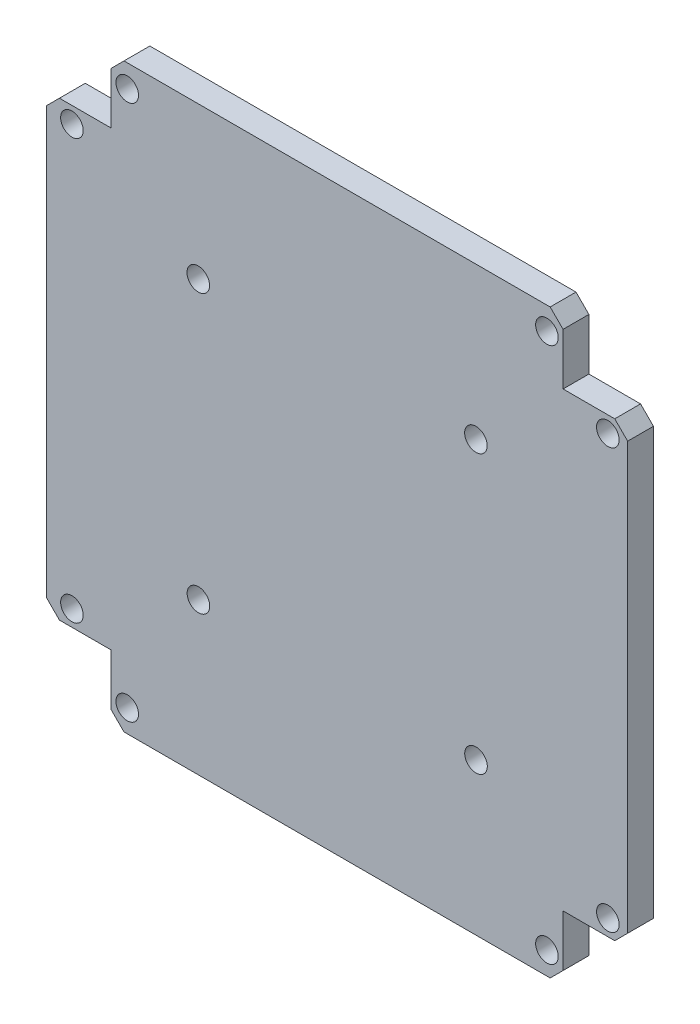
ISO-10303-21;
HEADER;
FILE_DESCRIPTION(('STEP AP214'),'2;1');
FILE_NAME('part.step','',(''),(''),'','','');
FILE_SCHEMA(('AUTOMOTIVE_DESIGN { 1 0 10303 214 1 1 1 1 }'));
ENDSEC;
DATA;
#1=APPLICATION_CONTEXT('core data for automotive mechanical design processes');
#2=APPLICATION_PROTOCOL_DEFINITION('international standard','automotive_design',2000,#1);
#3=PRODUCT_CONTEXT('',#1,'mechanical');
#4=PRODUCT('Part','Part','',(#3));
#5=PRODUCT_RELATED_PRODUCT_CATEGORY('part','',(#4));
#6=PRODUCT_DEFINITION_FORMATION('','',#4);
#7=PRODUCT_DEFINITION_CONTEXT('part definition',#1,'design');
#8=PRODUCT_DEFINITION('design','',#6,#7);
#9=PRODUCT_DEFINITION_SHAPE('','',#8);
#10=(LENGTH_UNIT() NAMED_UNIT(*) SI_UNIT(.MILLI.,.METRE.));
#11=(NAMED_UNIT(*) PLANE_ANGLE_UNIT() SI_UNIT($,.RADIAN.));
#12=(NAMED_UNIT(*) SI_UNIT($,.STERADIAN.) SOLID_ANGLE_UNIT());
#13=UNCERTAINTY_MEASURE_WITH_UNIT(LENGTH_MEASURE(1.E-05),#10,'distance_accuracy_value','');
#14=(GEOMETRIC_REPRESENTATION_CONTEXT(3) GLOBAL_UNCERTAINTY_ASSIGNED_CONTEXT((#13)) GLOBAL_UNIT_ASSIGNED_CONTEXT((#10,
#11,#12)) REPRESENTATION_CONTEXT('',''));
#15=CARTESIAN_POINT('',(0.,0.,0.));
#16=DIRECTION('',(0.,0.,1.));
#17=DIRECTION('',(1.,0.,0.));
#18=AXIS2_PLACEMENT_3D('',#15,#16,#17);
#19=CARTESIAN_POINT('',(-0.231726764970422,0.19337016574586,4.));
#20=DIRECTION('',(0.,1.,0.));
#21=DIRECTION('',(0.,0.,1.));
#22=AXIS2_PLACEMENT_3D('',#19,#20,#21);
#23=PLANE('',#22);
#24=DIRECTION('',(0.,0.,-1.));
#25=VECTOR('',#24,1.);
#26=CARTESIAN_POINT('',(9.76827323502952,0.19337016574586,3.99999999999999));
#27=LINE('',#26,#25);
#28=CARTESIAN_POINT('',(9.76827323502951,0.19337016574586,4.));
#29=VERTEX_POINT('',#28);
#30=CARTESIAN_POINT('',(9.76827323502951,0.19337016574586,0.));
#31=VERTEX_POINT('',#30);
#32=EDGE_CURVE('E191',#29,#31,#27,.T.);
#33=ORIENTED_EDGE('',*,*,#32,.F.);
#34=DIRECTION('',(1.,0.,0.));
#35=VECTOR('',#34,1.);
#36=CARTESIAN_POINT('',(-0.231726764970422,0.19337016574586,4.));
#37=LINE('',#36,#35);
#38=CARTESIAN_POINT('',(1.76827323502958,0.19337016574586,4.));
#39=VERTEX_POINT('',#38);
#40=EDGE_CURVE('E185',#39,#29,#37,.T.);
#41=ORIENTED_EDGE('',*,*,#40,.F.);
#42=DIRECTION('',(0.,0.,-1.));
#43=VECTOR('',#42,1.);
#44=CARTESIAN_POINT('',(1.76827323502958,0.19337016574586,4.));
#45=LINE('',#44,#43);
#46=CARTESIAN_POINT('',(1.76827323502958,0.19337016574586,0.));
#47=VERTEX_POINT('',#46);
#48=EDGE_CURVE('E304',#39,#47,#45,.T.);
#49=ORIENTED_EDGE('',*,*,#48,.T.);
#50=DIRECTION('',(1.,0.,0.));
#51=VECTOR('',#50,1.);
#52=CARTESIAN_POINT('',(-0.231726764970422,0.19337016574586,0.));
#53=LINE('',#52,#51);
#54=EDGE_CURVE('E265',#47,#31,#53,.T.);
#55=ORIENTED_EDGE('',*,*,#54,.T.);
#56=EDGE_LOOP('',(#33,#41,#49,#55));
#57=FACE_BOUND('',#56,.T.);
#58=ADVANCED_FACE('F33',(#57),#23,.F.);
#59=DIRECTION('',(0.,0.,1.));
#60=VECTOR('',#59,1.);
#61=CARTESIAN_POINT('',(79.7682732350295,0.19337016574586,4.));
#62=LINE('',#61,#60);
#63=CARTESIAN_POINT('',(79.7682732350295,0.19337016574586,0.));
#64=VERTEX_POINT('',#63);
#65=CARTESIAN_POINT('',(79.7682732350295,0.19337016574586,4.));
#66=VERTEX_POINT('',#65);
#67=EDGE_CURVE('E180',#64,#66,#62,.T.);
#68=ORIENTED_EDGE('',*,*,#67,.F.);
#69=CARTESIAN_POINT('',(87.7682732350295,0.19337016574586,0.));
#70=VERTEX_POINT('',#69);
#71=EDGE_CURVE('E263',#64,#70,#53,.T.);
#72=ORIENTED_EDGE('',*,*,#71,.T.);
#73=DIRECTION('',(0.,0.,1.));
#74=VECTOR('',#73,1.);
#75=CARTESIAN_POINT('',(87.7682732350295,0.19337016574586,4.));
#76=LINE('',#75,#74);
#77=CARTESIAN_POINT('',(87.7682732350295,0.19337016574586,4.));
#78=VERTEX_POINT('',#77);
#79=EDGE_CURVE('E183',#70,#78,#76,.T.);
#80=ORIENTED_EDGE('',*,*,#79,.T.);
#81=EDGE_CURVE('E169',#66,#78,#37,.T.);
#82=ORIENTED_EDGE('',*,*,#81,.F.);
#83=EDGE_LOOP('',(#68,#72,#80,#82));
#84=FACE_BOUND('',#83,.T.);
#85=ADVANCED_FACE('F179',(#84),#23,.F.);
#86=CARTESIAN_POINT('',(-0.231726764970422,70.1933701657459,4.));
#87=DIRECTION('',(0.,-1.,0.));
#88=DIRECTION('',(0.,0.,-1.));
#89=AXIS2_PLACEMENT_3D('',#86,#87,#88);
#90=PLANE('',#89);
#91=DIRECTION('',(0.,0.,1.));
#92=VECTOR('',#91,1.);
#93=CARTESIAN_POINT('',(9.76827323502961,70.1933701657459,4.));
#94=LINE('',#93,#92);
#95=CARTESIAN_POINT('',(9.7682732350296,70.1933701657459,0.));
#96=VERTEX_POINT('',#95);
#97=CARTESIAN_POINT('',(9.7682732350296,70.1933701657459,4.));
#98=VERTEX_POINT('',#97);
#99=EDGE_CURVE('E205',#96,#98,#94,.T.);
#100=ORIENTED_EDGE('',*,*,#99,.F.);
#101=DIRECTION('',(-1.,0.,0.));
#102=VECTOR('',#101,1.);
#103=CARTESIAN_POINT('',(-0.231726764970422,70.1933701657459,0.));
#104=LINE('',#103,#102);
#105=CARTESIAN_POINT('',(1.76827323502961,70.1933701657459,0.));
#106=VERTEX_POINT('',#105);
#107=EDGE_CURVE('E271',#96,#106,#104,.T.);
#108=ORIENTED_EDGE('',*,*,#107,.T.);
#109=DIRECTION('',(0.,0.,1.));
#110=VECTOR('',#109,1.);
#111=CARTESIAN_POINT('',(1.76827323502961,70.1933701657459,4.));
#112=LINE('',#111,#110);
#113=CARTESIAN_POINT('',(1.76827323502961,70.1933701657459,4.));
#114=VERTEX_POINT('',#113);
#115=EDGE_CURVE('E321',#106,#114,#112,.T.);
#116=ORIENTED_EDGE('',*,*,#115,.T.);
#117=DIRECTION('',(-1.,0.,0.));
#118=VECTOR('',#117,1.);
#119=CARTESIAN_POINT('',(-0.231726764970422,70.1933701657459,4.));
#120=LINE('',#119,#118);
#121=EDGE_CURVE('E256',#98,#114,#120,.T.);
#122=ORIENTED_EDGE('',*,*,#121,.F.);
#123=EDGE_LOOP('',(#100,#108,#116,#122));
#124=FACE_BOUND('',#123,.T.);
#125=ADVANCED_FACE('F486',(#124),#90,.F.);
#126=DIRECTION('',(0.,0.,-1.));
#127=VECTOR('',#126,1.);
#128=CARTESIAN_POINT('',(79.7682732350296,70.1933701657459,4.));
#129=LINE('',#128,#127);
#130=CARTESIAN_POINT('',(79.7682732350296,70.1933701657459,4.));
#131=VERTEX_POINT('',#130);
#132=CARTESIAN_POINT('',(79.7682732350296,70.1933701657459,0.));
#133=VERTEX_POINT('',#132);
#134=EDGE_CURVE('E210',#131,#133,#129,.T.);
#135=ORIENTED_EDGE('',*,*,#134,.F.);
#136=CARTESIAN_POINT('',(87.7682732350295,70.1933701657459,4.));
#137=VERTEX_POINT('',#136);
#138=EDGE_CURVE('E257',#137,#131,#120,.T.);
#139=ORIENTED_EDGE('',*,*,#138,.F.);
#140=DIRECTION('',(0.,0.,-1.));
#141=VECTOR('',#140,1.);
#142=CARTESIAN_POINT('',(87.7682732350296,70.1933701657459,4.));
#143=LINE('',#142,#141);
#144=CARTESIAN_POINT('',(87.7682732350295,70.1933701657459,0.));
#145=VERTEX_POINT('',#144);
#146=EDGE_CURVE('E326',#137,#145,#143,.T.);
#147=ORIENTED_EDGE('',*,*,#146,.T.);
#148=EDGE_CURVE('E250',#145,#133,#104,.T.);
#149=ORIENTED_EDGE('',*,*,#148,.T.);
#150=EDGE_LOOP('',(#135,#139,#147,#149));
#151=FACE_BOUND('',#150,.T.);
#152=ADVANCED_FACE('F392',(#151),#90,.F.);
#153=CARTESIAN_POINT('',(-0.231726764970422,0.19337016574586,4.));
#154=DIRECTION('',(1.,0.,0.));
#155=DIRECTION('',(0.,0.,-1.));
#156=AXIS2_PLACEMENT_3D('',#153,#154,#155);
#157=PLANE('',#156);
#158=DIRECTION('',(0.,-1.,0.));
#159=VECTOR('',#158,1.);
#160=CARTESIAN_POINT('',(-0.231726764970422,0.19337016574586,4.));
#161=LINE('',#160,#159);
#162=CARTESIAN_POINT('',(-0.231726764970422,68.1933701657458,4.));
#163=VERTEX_POINT('',#162);
#164=CARTESIAN_POINT('',(-0.231726764970422,2.19337016574588,4.));
#165=VERTEX_POINT('',#164);
#166=EDGE_CURVE('E186',#163,#165,#161,.T.);
#167=ORIENTED_EDGE('',*,*,#166,.F.);
#168=DIRECTION('',(0.,0.,-1.));
#169=VECTOR('',#168,1.);
#170=CARTESIAN_POINT('',(-0.231726764970422,68.1933701657458,4.));
#171=LINE('',#170,#169);
#172=CARTESIAN_POINT('',(-0.231726764970422,68.1933701657458,0.));
#173=VERTEX_POINT('',#172);
#174=EDGE_CURVE('E315',#163,#173,#171,.T.);
#175=ORIENTED_EDGE('',*,*,#174,.T.);
#176=DIRECTION('',(0.,-1.,0.));
#177=VECTOR('',#176,1.);
#178=CARTESIAN_POINT('',(-0.231726764970422,0.19337016574586,0.));
#179=LINE('',#178,#177);
#180=CARTESIAN_POINT('',(-0.231726764970422,2.19337016574588,0.));
#181=VERTEX_POINT('',#180);
#182=EDGE_CURVE('E261',#173,#181,#179,.T.);
#183=ORIENTED_EDGE('',*,*,#182,.T.);
#184=DIRECTION('',(0.,0.,1.));
#185=VECTOR('',#184,1.);
#186=CARTESIAN_POINT('',(-0.231726764970422,2.19337016574588,4.));
#187=LINE('',#186,#185);
#188=EDGE_CURVE('E310',#181,#165,#187,.T.);
#189=ORIENTED_EDGE('',*,*,#188,.T.);
#190=EDGE_LOOP('',(#167,#175,#183,#189));
#191=FACE_BOUND('',#190,.T.);
#192=ADVANCED_FACE('F477',(#191),#157,.F.);
#193=CARTESIAN_POINT('',(89.7682732350296,0.19337016574586,4.));
#194=DIRECTION('',(-1.,0.,0.));
#195=DIRECTION('',(0.,0.,1.));
#196=AXIS2_PLACEMENT_3D('',#193,#194,#195);
#197=PLANE('',#196);
#198=DIRECTION('',(0.,1.,0.));
#199=VECTOR('',#198,1.);
#200=CARTESIAN_POINT('',(89.7682732350296,0.19337016574586,0.));
#201=LINE('',#200,#199);
#202=CARTESIAN_POINT('',(89.7682732350296,2.19337016574588,0.));
#203=VERTEX_POINT('',#202);
#204=CARTESIAN_POINT('',(89.7682732350296,68.1933701657458,0.));
#205=VERTEX_POINT('',#204);
#206=EDGE_CURVE('E268',#203,#205,#201,.T.);
#207=ORIENTED_EDGE('',*,*,#206,.T.);
#208=DIRECTION('',(0.,0.,1.));
#209=VECTOR('',#208,1.);
#210=CARTESIAN_POINT('',(89.7682732350296,68.1933701657458,4.));
#211=LINE('',#210,#209);
#212=CARTESIAN_POINT('',(89.7682732350296,68.1933701657458,4.));
#213=VERTEX_POINT('',#212);
#214=EDGE_CURVE('E331',#205,#213,#211,.T.);
#215=ORIENTED_EDGE('',*,*,#214,.T.);
#216=DIRECTION('',(0.,1.,0.));
#217=VECTOR('',#216,1.);
#218=CARTESIAN_POINT('',(89.7682732350296,0.19337016574586,4.));
#219=LINE('',#218,#217);
#220=CARTESIAN_POINT('',(89.7682732350296,2.19337016574588,4.));
#221=VERTEX_POINT('',#220);
#222=EDGE_CURVE('E253',#221,#213,#219,.T.);
#223=ORIENTED_EDGE('',*,*,#222,.F.);
#224=DIRECTION('',(0.,0.,-1.));
#225=VECTOR('',#224,1.);
#226=CARTESIAN_POINT('',(89.7682732350296,2.19337016574588,4.));
#227=LINE('',#226,#225);
#228=EDGE_CURVE('E260',#221,#203,#227,.T.);
#229=ORIENTED_EDGE('',*,*,#228,.T.);
#230=EDGE_LOOP('',(#207,#215,#223,#229));
#231=FACE_BOUND('',#230,.T.);
#232=ADVANCED_FACE('F401',(#231),#197,.F.);
#233=CARTESIAN_POINT('',(0.,0.,4.));
#234=DIRECTION('',(0.,0.,-1.));
#235=DIRECTION('',(-1.,0.,0.));
#236=AXIS2_PLACEMENT_3D('',#233,#234,#235);
#237=PLANE('',#236);
#238=CARTESIAN_POINT('',(12.2682732350295,-6.30662983425415,4.));
#239=DIRECTION('',(0.,0.,-1.));
#240=DIRECTION('',(-1.,0.,0.));
#241=AXIS2_PLACEMENT_3D('',#238,#239,#240);
#242=CIRCLE('',#241,1.75);
#243=CARTESIAN_POINT('',(10.5182732350295,-6.30662983425415,4.));
#244=VERTEX_POINT('',#243);
#245=EDGE_CURVE('E197',#244,#244,#242,.T.);
#246=ORIENTED_EDGE('',*,*,#245,.T.);
#247=EDGE_LOOP('',(#246));
#248=FACE_BOUND('',#247,.T.);
#249=CARTESIAN_POINT('',(77.2682732350295,-6.30662983425415,4.));
#250=DIRECTION('',(0.,0.,-1.));
#251=DIRECTION('',(-1.,0.,0.));
#252=AXIS2_PLACEMENT_3D('',#249,#250,#251);
#253=CIRCLE('',#252,1.75);
#254=CARTESIAN_POINT('',(75.5182732350295,-6.30662983425415,4.));
#255=VERTEX_POINT('',#254);
#256=EDGE_CURVE('E417',#255,#255,#253,.T.);
#257=ORIENTED_EDGE('',*,*,#256,.T.);
#258=EDGE_LOOP('',(#257));
#259=FACE_BOUND('',#258,.T.);
#260=CARTESIAN_POINT('',(77.2682732350296,76.6933701657459,4.));
#261=DIRECTION('',(0.,0.,-1.));
#262=DIRECTION('',(-1.,0.,0.));
#263=AXIS2_PLACEMENT_3D('',#260,#261,#262);
#264=CIRCLE('',#263,1.75);
#265=CARTESIAN_POINT('',(75.5182732350296,76.6933701657459,4.));
#266=VERTEX_POINT('',#265);
#267=EDGE_CURVE('E420',#266,#266,#264,.T.);
#268=ORIENTED_EDGE('',*,*,#267,.T.);
#269=EDGE_LOOP('',(#268));
#270=FACE_BOUND('',#269,.T.);
#271=CARTESIAN_POINT('',(12.2682732350296,76.6933701657459,4.));
#272=DIRECTION('',(0.,0.,-1.));
#273=DIRECTION('',(-1.,0.,0.));
#274=AXIS2_PLACEMENT_3D('',#271,#272,#273);
#275=CIRCLE('',#274,1.75);
#276=CARTESIAN_POINT('',(10.5182732350296,76.6933701657459,4.));
#277=VERTEX_POINT('',#276);
#278=EDGE_CURVE('E423',#277,#277,#275,.T.);
#279=ORIENTED_EDGE('',*,*,#278,.T.);
#280=EDGE_LOOP('',(#279));
#281=FACE_BOUND('',#280,.T.);
#282=CARTESIAN_POINT('',(86.7035687828234,2.69443656663015,4.));
#283=DIRECTION('',(0.,0.,1.));
#284=DIRECTION('',(1.,0.,0.));
#285=AXIS2_PLACEMENT_3D('',#282,#283,#284);
#286=CIRCLE('',#285,1.75);
#287=CARTESIAN_POINT('',(88.4535687828234,2.69443656663015,4.));
#288=VERTEX_POINT('',#287);
#289=EDGE_CURVE('E235',#288,#288,#286,.T.);
#290=ORIENTED_EDGE('',*,*,#289,.F.);
#291=EDGE_LOOP('',(#290));
#292=FACE_BOUND('',#291,.T.);
#293=CARTESIAN_POINT('',(86.7032732350296,67.6933701657459,4.));
#294=DIRECTION('',(0.,0.,1.));
#295=DIRECTION('',(1.,0.,0.));
#296=AXIS2_PLACEMENT_3D('',#293,#294,#295);
#297=CIRCLE('',#296,1.75);
#298=CARTESIAN_POINT('',(88.4532732350296,67.6933701657459,4.));
#299=VERTEX_POINT('',#298);
#300=EDGE_CURVE('E239',#299,#299,#297,.T.);
#301=ORIENTED_EDGE('',*,*,#300,.F.);
#302=EDGE_LOOP('',(#301));
#303=FACE_BOUND('',#302,.T.);
#304=CARTESIAN_POINT('',(3.70327323502957,67.6933701657459,4.));
#305=DIRECTION('',(0.,0.,1.));
#306=DIRECTION('',(1.,0.,0.));
#307=AXIS2_PLACEMENT_3D('',#304,#305,#306);
#308=CIRCLE('',#307,1.75);
#309=CARTESIAN_POINT('',(5.45327323502957,67.6933701657459,4.));
#310=VERTEX_POINT('',#309);
#311=EDGE_CURVE('E242',#310,#310,#308,.T.);
#312=ORIENTED_EDGE('',*,*,#311,.F.);
#313=EDGE_LOOP('',(#312));
#314=FACE_BOUND('',#313,.T.);
#315=CARTESIAN_POINT('',(66.2840519009856,13.6933701657459,4.));
#316=DIRECTION('',(0.,0.,1.));
#317=DIRECTION('',(1.,0.,0.));
#318=AXIS2_PLACEMENT_3D('',#315,#316,#317);
#319=CIRCLE('',#318,1.75);
#320=CARTESIAN_POINT('',(68.0340519009856,13.6933701657459,4.));
#321=VERTEX_POINT('',#320);
#322=EDGE_CURVE('E232',#321,#321,#319,.T.);
#323=ORIENTED_EDGE('',*,*,#322,.F.);
#324=EDGE_LOOP('',(#323));
#325=FACE_BOUND('',#324,.T.);
#326=CARTESIAN_POINT('',(23.2682732350296,56.6933701657459,4.));
#327=DIRECTION('',(0.,0.,1.));
#328=DIRECTION('',(1.,0.,0.));
#329=AXIS2_PLACEMENT_3D('',#326,#327,#328);
#330=CIRCLE('',#329,1.75);
#331=CARTESIAN_POINT('',(25.0182732350296,56.6933701657459,4.));
#332=VERTEX_POINT('',#331);
#333=EDGE_CURVE('E225',#332,#332,#330,.T.);
#334=ORIENTED_EDGE('',*,*,#333,.F.);
#335=EDGE_LOOP('',(#334));
#336=FACE_BOUND('',#335,.T.);
#337=CARTESIAN_POINT('',(66.2682732350296,56.6933701657459,4.));
#338=DIRECTION('',(0.,0.,1.));
#339=DIRECTION('',(1.,0.,0.));
#340=AXIS2_PLACEMENT_3D('',#337,#338,#339);
#341=CIRCLE('',#340,1.75);
#342=CARTESIAN_POINT('',(68.0182732350296,56.6933701657459,4.));
#343=VERTEX_POINT('',#342);
#344=EDGE_CURVE('E228',#343,#343,#341,.T.);
#345=ORIENTED_EDGE('',*,*,#344,.F.);
#346=EDGE_LOOP('',(#345));
#347=FACE_BOUND('',#346,.T.);
#348=CARTESIAN_POINT('',(23.2977256719141,13.6933701657459,4.));
#349=DIRECTION('',(0.,0.,1.));
#350=DIRECTION('',(1.,0.,0.));
#351=AXIS2_PLACEMENT_3D('',#348,#349,#350);
#352=CIRCLE('',#351,1.75);
#353=CARTESIAN_POINT('',(25.0477256719141,13.6933701657459,4.));
#354=VERTEX_POINT('',#353);
#355=EDGE_CURVE('E229',#354,#354,#352,.T.);
#356=ORIENTED_EDGE('',*,*,#355,.F.);
#357=EDGE_LOOP('',(#356));
#358=FACE_BOUND('',#357,.T.);
#359=CARTESIAN_POINT('',(3.70356878282337,2.69337016574586,4.));
#360=DIRECTION('',(0.,0.,1.));
#361=DIRECTION('',(1.,0.,0.));
#362=AXIS2_PLACEMENT_3D('',#359,#360,#361);
#363=CIRCLE('',#362,1.75);
#364=CARTESIAN_POINT('',(5.45356878282337,2.69337016574586,4.));
#365=VERTEX_POINT('',#364);
#366=EDGE_CURVE('E238',#365,#365,#363,.T.);
#367=ORIENTED_EDGE('',*,*,#366,.F.);
#368=EDGE_LOOP('',(#367));
#369=FACE_BOUND('',#368,.T.);
#370=DIRECTION('',(0.,1.,0.));
#371=VECTOR('',#370,1.);
#372=CARTESIAN_POINT('',(9.76827323502952,-9.80662983425414,3.99999999999999));
#373=LINE('',#372,#371);
#374=CARTESIAN_POINT('',(9.76827323502952,-7.80662983425414,3.99999999999999));
#375=VERTEX_POINT('',#374);
#376=EDGE_CURVE('E175',#375,#29,#373,.T.);
#377=ORIENTED_EDGE('',*,*,#376,.F.);
#378=DIRECTION('',(0.707106781186545,-0.70710678118655,0.));
#379=VECTOR('',#378,1.);
#380=CARTESIAN_POINT('',(11.7682732350295,-9.80662983425414,4.));
#381=LINE('',#380,#379);
#382=CARTESIAN_POINT('',(11.7682732350295,-9.80662983425414,3.99999999999999));
#383=VERTEX_POINT('',#382);
#384=EDGE_CURVE('E355',#375,#383,#381,.T.);
#385=ORIENTED_EDGE('',*,*,#384,.T.);
#386=DIRECTION('',(-1.,0.,0.));
#387=VECTOR('',#386,1.);
#388=CARTESIAN_POINT('',(9.76827323502952,-9.80662983425414,3.99999999999999));
#389=LINE('',#388,#387);
#390=CARTESIAN_POINT('',(77.7682732350296,-9.80662983425414,4.));
#391=VERTEX_POINT('',#390);
#392=EDGE_CURVE('E194',#391,#383,#389,.T.);
#393=ORIENTED_EDGE('',*,*,#392,.F.);
#394=DIRECTION('',(0.707106781186543,0.707106781186552,0.));
#395=VECTOR('',#394,1.);
#396=CARTESIAN_POINT('',(77.7682732350296,-9.80662983425414,4.));
#397=LINE('',#396,#395);
#398=CARTESIAN_POINT('',(79.7682732350295,-7.80662983425414,4.));
#399=VERTEX_POINT('',#398);
#400=EDGE_CURVE('E48',#391,#399,#397,.T.);
#401=ORIENTED_EDGE('',*,*,#400,.T.);
#402=DIRECTION('',(0.,1.,0.));
#403=VECTOR('',#402,1.);
#404=CARTESIAN_POINT('',(79.7682732350295,-9.80662983425414,4.));
#405=LINE('',#404,#403);
#406=EDGE_CURVE('E165',#399,#66,#405,.T.);
#407=ORIENTED_EDGE('',*,*,#406,.T.);
#408=ORIENTED_EDGE('',*,*,#81,.T.);
#409=DIRECTION('',(-0.70710678118655,-0.707106781186545,0.));
#410=VECTOR('',#409,1.);
#411=CARTESIAN_POINT('',(89.7682732350296,2.19337016574588,4.));
#412=LINE('',#411,#410);
#413=EDGE_CURVE('E302',#78,#221,#412,.F.);
#414=ORIENTED_EDGE('',*,*,#413,.T.);
#415=ORIENTED_EDGE('',*,*,#222,.T.);
#416=DIRECTION('',(0.707106781186543,-0.707106781186552,0.));
#417=VECTOR('',#416,1.);
#418=CARTESIAN_POINT('',(87.7682732350296,70.1933701657459,4.));
#419=LINE('',#418,#417);
#420=EDGE_CURVE('E333',#213,#137,#419,.F.);
#421=ORIENTED_EDGE('',*,*,#420,.T.);
#422=ORIENTED_EDGE('',*,*,#138,.T.);
#423=DIRECTION('',(0.,-1.,0.));
#424=VECTOR('',#423,1.);
#425=CARTESIAN_POINT('',(79.7682732350296,80.1933701657459,4.));
#426=LINE('',#425,#424);
#427=CARTESIAN_POINT('',(79.7682732350296,78.1933701657458,4.));
#428=VERTEX_POINT('',#427);
#429=EDGE_CURVE('E221',#428,#131,#426,.T.);
#430=ORIENTED_EDGE('',*,*,#429,.F.);
#431=DIRECTION('',(0.707106781186543,-0.707106781186552,0.));
#432=VECTOR('',#431,1.);
#433=CARTESIAN_POINT('',(77.7682732350296,80.1933701657459,4.));
#434=LINE('',#433,#432);
#435=CARTESIAN_POINT('',(77.7682732350296,80.1933701657459,4.));
#436=VERTEX_POINT('',#435);
#437=EDGE_CURVE('E351',#428,#436,#434,.F.);
#438=ORIENTED_EDGE('',*,*,#437,.T.);
#439=DIRECTION('',(1.,0.,0.));
#440=VECTOR('',#439,1.);
#441=CARTESIAN_POINT('',(9.76827323502961,80.1933701657459,4.));
#442=LINE('',#441,#440);
#443=CARTESIAN_POINT('',(11.7682732350296,80.1933701657459,4.));
#444=VERTEX_POINT('',#443);
#445=EDGE_CURVE('E206',#444,#436,#442,.T.);
#446=ORIENTED_EDGE('',*,*,#445,.F.);
#447=DIRECTION('',(0.707106781186545,0.70710678118655,0.));
#448=VECTOR('',#447,1.);
#449=CARTESIAN_POINT('',(11.7682732350296,80.1933701657459,4.));
#450=LINE('',#449,#448);
#451=CARTESIAN_POINT('',(9.76827323502961,78.1933701657459,4.));
#452=VERTEX_POINT('',#451);
#453=EDGE_CURVE('E55',#444,#452,#450,.F.);
#454=ORIENTED_EDGE('',*,*,#453,.T.);
#455=DIRECTION('',(0.,-1.,0.));
#456=VECTOR('',#455,1.);
#457=CARTESIAN_POINT('',(9.76827323502961,80.1933701657459,4.));
#458=LINE('',#457,#456);
#459=EDGE_CURVE('E223',#452,#98,#458,.T.);
#460=ORIENTED_EDGE('',*,*,#459,.T.);
#461=ORIENTED_EDGE('',*,*,#121,.T.);
#462=DIRECTION('',(0.70710678118655,0.707106781186545,0.));
#463=VECTOR('',#462,1.);
#464=CARTESIAN_POINT('',(-0.231726764970422,68.1933701657458,4.));
#465=LINE('',#464,#463);
#466=EDGE_CURVE('E324',#114,#163,#465,.F.);
#467=ORIENTED_EDGE('',*,*,#466,.T.);
#468=ORIENTED_EDGE('',*,*,#166,.T.);
#469=DIRECTION('',(-0.707106781186545,0.70710678118655,0.));
#470=VECTOR('',#469,1.);
#471=CARTESIAN_POINT('',(1.76827323502958,0.19337016574586,4.));
#472=LINE('',#471,#470);
#473=EDGE_CURVE('E313',#165,#39,#472,.F.);
#474=ORIENTED_EDGE('',*,*,#473,.T.);
#475=ORIENTED_EDGE('',*,*,#40,.T.);
#476=EDGE_LOOP('',(#377,#385,#393,#401,#407,#408,#414,#415,#421,#422,#430,#438,#446,#454,#460,
#461,#467,#468,#474,#475));
#477=FACE_BOUND('',#476,.T.);
#478=ADVANCED_FACE('F168',(#248,#259,#270,#281,#292,#303,#314,#325,#336,#347,#358,#369,#477),
#237,.F.);
#479=CARTESIAN_POINT('',(0.,0.,0.));
#480=DIRECTION('',(0.,0.,-1.));
#481=DIRECTION('',(-1.,0.,0.));
#482=AXIS2_PLACEMENT_3D('',#479,#480,#481);
#483=PLANE('',#482);
#484=CARTESIAN_POINT('',(12.2682732350295,-6.30662983425415,0.));
#485=DIRECTION('',(0.,0.,-1.));
#486=DIRECTION('',(-1.,0.,0.));
#487=AXIS2_PLACEMENT_3D('',#484,#485,#486);
#488=CIRCLE('',#487,1.75);
#489=CARTESIAN_POINT('',(10.5182732350295,-6.30662983425415,0.));
#490=VERTEX_POINT('',#489);
#491=EDGE_CURVE('E430',#490,#490,#488,.T.);
#492=ORIENTED_EDGE('',*,*,#491,.F.);
#493=EDGE_LOOP('',(#492));
#494=FACE_BOUND('',#493,.T.);
#495=CARTESIAN_POINT('',(77.2682732350295,-6.30662983425415,0.));
#496=DIRECTION('',(0.,0.,-1.));
#497=DIRECTION('',(-1.,0.,0.));
#498=AXIS2_PLACEMENT_3D('',#495,#496,#497);
#499=CIRCLE('',#498,1.75);
#500=CARTESIAN_POINT('',(75.5182732350295,-6.30662983425415,0.));
#501=VERTEX_POINT('',#500);
#502=EDGE_CURVE('E433',#501,#501,#499,.T.);
#503=ORIENTED_EDGE('',*,*,#502,.F.);
#504=EDGE_LOOP('',(#503));
#505=FACE_BOUND('',#504,.T.);
#506=CARTESIAN_POINT('',(77.2682732350296,76.6933701657459,0.));
#507=DIRECTION('',(0.,0.,-1.));
#508=DIRECTION('',(-1.,0.,0.));
#509=AXIS2_PLACEMENT_3D('',#506,#507,#508);
#510=CIRCLE('',#509,1.75);
#511=CARTESIAN_POINT('',(75.5182732350296,76.6933701657459,0.));
#512=VERTEX_POINT('',#511);
#513=EDGE_CURVE('E429',#512,#512,#510,.T.);
#514=ORIENTED_EDGE('',*,*,#513,.F.);
#515=EDGE_LOOP('',(#514));
#516=FACE_BOUND('',#515,.T.);
#517=CARTESIAN_POINT('',(12.2682732350296,76.6933701657459,0.));
#518=DIRECTION('',(0.,0.,-1.));
#519=DIRECTION('',(-1.,0.,0.));
#520=AXIS2_PLACEMENT_3D('',#517,#518,#519);
#521=CIRCLE('',#520,1.75);
#522=CARTESIAN_POINT('',(10.5182732350296,76.6933701657459,0.));
#523=VERTEX_POINT('',#522);
#524=EDGE_CURVE('E426',#523,#523,#521,.T.);
#525=ORIENTED_EDGE('',*,*,#524,.F.);
#526=EDGE_LOOP('',(#525));
#527=FACE_BOUND('',#526,.T.);
#528=CARTESIAN_POINT('',(86.7035687828234,2.69443656663015,0.));
#529=DIRECTION('',(0.,0.,-1.));
#530=DIRECTION('',(-1.,0.,0.));
#531=AXIS2_PLACEMENT_3D('',#528,#529,#530);
#532=CIRCLE('',#531,1.75);
#533=CARTESIAN_POINT('',(84.9535687828234,2.69443656663015,0.));
#534=VERTEX_POINT('',#533);
#535=EDGE_CURVE('E264',#534,#534,#532,.T.);
#536=ORIENTED_EDGE('',*,*,#535,.F.);
#537=EDGE_LOOP('',(#536));
#538=FACE_BOUND('',#537,.T.);
#539=CARTESIAN_POINT('',(86.7032732350296,67.6933701657459,0.));
#540=DIRECTION('',(0.,0.,-1.));
#541=DIRECTION('',(-1.,0.,0.));
#542=AXIS2_PLACEMENT_3D('',#539,#540,#541);
#543=CIRCLE('',#542,1.75);
#544=CARTESIAN_POINT('',(84.9532732350296,67.6933701657459,0.));
#545=VERTEX_POINT('',#544);
#546=EDGE_CURVE('E291',#545,#545,#543,.T.);
#547=ORIENTED_EDGE('',*,*,#546,.F.);
#548=EDGE_LOOP('',(#547));
#549=FACE_BOUND('',#548,.T.);
#550=CARTESIAN_POINT('',(3.70327323502957,67.6933701657459,0.));
#551=DIRECTION('',(0.,0.,-1.));
#552=DIRECTION('',(-1.,0.,0.));
#553=AXIS2_PLACEMENT_3D('',#550,#551,#552);
#554=CIRCLE('',#553,1.75);
#555=CARTESIAN_POINT('',(1.95327323502957,67.6933701657459,0.));
#556=VERTEX_POINT('',#555);
#557=EDGE_CURVE('E288',#556,#556,#554,.T.);
#558=ORIENTED_EDGE('',*,*,#557,.F.);
#559=EDGE_LOOP('',(#558));
#560=FACE_BOUND('',#559,.T.);
#561=CARTESIAN_POINT('',(66.2840519009856,13.6933701657459,0.));
#562=DIRECTION('',(0.,0.,-1.));
#563=DIRECTION('',(-1.,0.,0.));
#564=AXIS2_PLACEMENT_3D('',#561,#562,#563);
#565=CIRCLE('',#564,1.75);
#566=CARTESIAN_POINT('',(64.5340519009856,13.6933701657459,0.));
#567=VERTEX_POINT('',#566);
#568=EDGE_CURVE('E285',#567,#567,#565,.T.);
#569=ORIENTED_EDGE('',*,*,#568,.F.);
#570=EDGE_LOOP('',(#569));
#571=FACE_BOUND('',#570,.T.);
#572=CARTESIAN_POINT('',(23.2682732350296,56.6933701657459,0.));
#573=DIRECTION('',(0.,0.,-1.));
#574=DIRECTION('',(-1.,0.,0.));
#575=AXIS2_PLACEMENT_3D('',#572,#573,#574);
#576=CIRCLE('',#575,1.75);
#577=CARTESIAN_POINT('',(21.5182732350296,56.6933701657459,0.));
#578=VERTEX_POINT('',#577);
#579=EDGE_CURVE('E282',#578,#578,#576,.T.);
#580=ORIENTED_EDGE('',*,*,#579,.F.);
#581=EDGE_LOOP('',(#580));
#582=FACE_BOUND('',#581,.T.);
#583=CARTESIAN_POINT('',(66.2682732350296,56.6933701657459,0.));
#584=DIRECTION('',(0.,0.,-1.));
#585=DIRECTION('',(-1.,0.,0.));
#586=AXIS2_PLACEMENT_3D('',#583,#584,#585);
#587=CIRCLE('',#586,1.75);
#588=CARTESIAN_POINT('',(64.5182732350296,56.6933701657459,0.));
#589=VERTEX_POINT('',#588);
#590=EDGE_CURVE('E279',#589,#589,#587,.T.);
#591=ORIENTED_EDGE('',*,*,#590,.F.);
#592=EDGE_LOOP('',(#591));
#593=FACE_BOUND('',#592,.T.);
#594=CARTESIAN_POINT('',(23.2977256719141,13.6933701657459,0.));
#595=DIRECTION('',(0.,0.,-1.));
#596=DIRECTION('',(-1.,0.,0.));
#597=AXIS2_PLACEMENT_3D('',#594,#595,#596);
#598=CIRCLE('',#597,1.75);
#599=CARTESIAN_POINT('',(21.5477256719141,13.6933701657459,0.));
#600=VERTEX_POINT('',#599);
#601=EDGE_CURVE('E276',#600,#600,#598,.T.);
#602=ORIENTED_EDGE('',*,*,#601,.F.);
#603=EDGE_LOOP('',(#602));
#604=FACE_BOUND('',#603,.T.);
#605=CARTESIAN_POINT('',(3.70356878282337,2.69337016574586,0.));
#606=DIRECTION('',(0.,0.,-1.));
#607=DIRECTION('',(-1.,0.,0.));
#608=AXIS2_PLACEMENT_3D('',#605,#606,#607);
#609=CIRCLE('',#608,1.75);
#610=CARTESIAN_POINT('',(1.95356878282337,2.69337016574586,0.));
#611=VERTEX_POINT('',#610);
#612=EDGE_CURVE('E249',#611,#611,#609,.T.);
#613=ORIENTED_EDGE('',*,*,#612,.F.);
#614=EDGE_LOOP('',(#613));
#615=FACE_BOUND('',#614,.T.);
#616=DIRECTION('',(1.,0.,0.));
#617=VECTOR('',#616,1.);
#618=CARTESIAN_POINT('',(9.76827323502952,-9.80662983425414,0.));
#619=LINE('',#618,#617);
#620=CARTESIAN_POINT('',(11.7682732350295,-9.80662983425414,0.));
#621=VERTEX_POINT('',#620);
#622=CARTESIAN_POINT('',(77.7682732350296,-9.80662983425414,0.));
#623=VERTEX_POINT('',#622);
#624=EDGE_CURVE('E190',#621,#623,#619,.T.);
#625=ORIENTED_EDGE('',*,*,#624,.F.);
#626=DIRECTION('',(-0.707106781186545,0.70710678118655,0.));
#627=VECTOR('',#626,1.);
#628=CARTESIAN_POINT('',(0.980821700387723,0.980821700387717,0.));
#629=LINE('',#628,#627);
#630=CARTESIAN_POINT('',(9.76827323502952,-7.80662983425414,0.));
#631=VERTEX_POINT('',#630);
#632=EDGE_CURVE('E347',#621,#631,#629,.T.);
#633=ORIENTED_EDGE('',*,*,#632,.T.);
#634=DIRECTION('',(0.,1.,0.));
#635=VECTOR('',#634,1.);
#636=CARTESIAN_POINT('',(9.76827323502952,-9.80662983425414,0.));
#637=LINE('',#636,#635);
#638=EDGE_CURVE('E203',#631,#31,#637,.T.);
#639=ORIENTED_EDGE('',*,*,#638,.T.);
#640=ORIENTED_EDGE('',*,*,#54,.F.);
#641=DIRECTION('',(0.707106781186545,-0.70710678118655,0.));
#642=VECTOR('',#641,1.);
#643=CARTESIAN_POINT('',(0.980821700387726,0.980821700387719,0.));
#644=LINE('',#643,#642);
#645=EDGE_CURVE('E307',#47,#181,#644,.F.);
#646=ORIENTED_EDGE('',*,*,#645,.T.);
#647=ORIENTED_EDGE('',*,*,#182,.F.);
#648=DIRECTION('',(-0.70710678118655,-0.707106781186545,0.));
#649=VECTOR('',#648,1.);
#650=CARTESIAN_POINT('',(-34.2125484653581,34.2125484653584,0.));
#651=LINE('',#650,#649);
#652=EDGE_CURVE('E318',#173,#106,#651,.F.);
#653=ORIENTED_EDGE('',*,*,#652,.T.);
#654=ORIENTED_EDGE('',*,*,#107,.F.);
#655=DIRECTION('',(0.,-1.,0.));
#656=VECTOR('',#655,1.);
#657=CARTESIAN_POINT('',(9.76827323502961,80.1933701657459,0.));
#658=LINE('',#657,#656);
#659=CARTESIAN_POINT('',(9.76827323502961,78.1933701657459,0.));
#660=VERTEX_POINT('',#659);
#661=EDGE_CURVE('E213',#660,#96,#658,.T.);
#662=ORIENTED_EDGE('',*,*,#661,.F.);
#663=DIRECTION('',(-0.707106781186545,-0.70710678118655,0.));
#664=VECTOR('',#663,1.);
#665=CARTESIAN_POINT('',(-34.2125484653581,34.2125484653578,0.));
#666=LINE('',#665,#664);
#667=CARTESIAN_POINT('',(11.7682732350296,80.1933701657459,0.));
#668=VERTEX_POINT('',#667);
#669=EDGE_CURVE('E343',#660,#668,#666,.F.);
#670=ORIENTED_EDGE('',*,*,#669,.T.);
#671=DIRECTION('',(-1.,0.,0.));
#672=VECTOR('',#671,1.);
#673=CARTESIAN_POINT('',(9.76827323502961,80.1933701657459,0.));
#674=LINE('',#673,#672);
#675=CARTESIAN_POINT('',(77.7682732350296,80.1933701657459,0.));
#676=VERTEX_POINT('',#675);
#677=EDGE_CURVE('E209',#676,#668,#674,.T.);
#678=ORIENTED_EDGE('',*,*,#677,.F.);
#679=DIRECTION('',(-0.707106781186543,0.707106781186552,0.));
#680=VECTOR('',#679,1.);
#681=CARTESIAN_POINT('',(78.9808217003883,78.9808217003872,0.));
#682=LINE('',#681,#680);
#683=CARTESIAN_POINT('',(79.7682732350296,78.1933701657458,0.));
#684=VERTEX_POINT('',#683);
#685=EDGE_CURVE('E341',#676,#684,#682,.F.);
#686=ORIENTED_EDGE('',*,*,#685,.T.);
#687=DIRECTION('',(0.,-1.,0.));
#688=VECTOR('',#687,1.);
#689=CARTESIAN_POINT('',(79.7682732350296,80.1933701657459,0.));
#690=LINE('',#689,#688);
#691=EDGE_CURVE('E219',#684,#133,#690,.T.);
#692=ORIENTED_EDGE('',*,*,#691,.T.);
#693=ORIENTED_EDGE('',*,*,#148,.F.);
#694=DIRECTION('',(-0.707106781186543,0.707106781186552,0.));
#695=VECTOR('',#694,1.);
#696=CARTESIAN_POINT('',(78.9808217003883,78.9808217003872,0.));
#697=LINE('',#696,#695);
#698=EDGE_CURVE('E329',#145,#205,#697,.F.);
#699=ORIENTED_EDGE('',*,*,#698,.T.);
#700=ORIENTED_EDGE('',*,*,#206,.F.);
#701=DIRECTION('',(0.70710678118655,0.707106781186545,0.));
#702=VECTOR('',#701,1.);
#703=CARTESIAN_POINT('',(43.7874515346415,-43.7874515346418,0.));
#704=LINE('',#703,#702);
#705=EDGE_CURVE('E298',#203,#70,#704,.F.);
#706=ORIENTED_EDGE('',*,*,#705,.T.);
#707=ORIENTED_EDGE('',*,*,#71,.F.);
#708=DIRECTION('',(0.,1.,0.));
#709=VECTOR('',#708,1.);
#710=CARTESIAN_POINT('',(79.7682732350295,-9.80662983425414,0.));
#711=LINE('',#710,#709);
#712=CARTESIAN_POINT('',(79.7682732350295,-7.80662983425414,0.));
#713=VERTEX_POINT('',#712);
#714=EDGE_CURVE('E174',#713,#64,#711,.T.);
#715=ORIENTED_EDGE('',*,*,#714,.F.);
#716=DIRECTION('',(-0.707106781186543,-0.707106781186552,0.));
#717=VECTOR('',#716,1.);
#718=CARTESIAN_POINT('',(43.7874515346424,-43.7874515346418,0.));
#719=LINE('',#718,#717);
#720=EDGE_CURVE('E345',#713,#623,#719,.T.);
#721=ORIENTED_EDGE('',*,*,#720,.T.);
#722=EDGE_LOOP('',(#625,#633,#639,#640,#646,#647,#653,#654,#662,#670,#678,#686,#692,#693,#699,
#700,#706,#707,#715,#721));
#723=FACE_BOUND('',#722,.T.);
#724=ADVANCED_FACE('F374',(#494,#505,#516,#527,#538,#549,#560,#571,#582,#593,#604,#615,#723),
#483,.T.);
#725=CARTESIAN_POINT('',(3.70356878282337,2.69337016574586,-1.));
#726=DIRECTION('',(0.,0.,1.));
#727=DIRECTION('',(1.,0.,0.));
#728=AXIS2_PLACEMENT_3D('',#725,#726,#727);
#729=CYLINDRICAL_SURFACE('',#728,1.75);
#730=ORIENTED_EDGE('',*,*,#612,.T.);
#731=EDGE_LOOP('',(#730));
#732=FACE_BOUND('',#731,.T.);
#733=ORIENTED_EDGE('',*,*,#366,.T.);
#734=EDGE_LOOP('',(#733));
#735=FACE_BOUND('',#734,.T.);
#736=ADVANCED_FACE('F444',(#732,#735),#729,.F.);
#737=CARTESIAN_POINT('',(23.2977256719141,13.6933701657459,-1.));
#738=DIRECTION('',(0.,0.,1.));
#739=DIRECTION('',(1.,0.,0.));
#740=AXIS2_PLACEMENT_3D('',#737,#738,#739);
#741=CYLINDRICAL_SURFACE('',#740,1.75);
#742=ORIENTED_EDGE('',*,*,#601,.T.);
#743=EDGE_LOOP('',(#742));
#744=FACE_BOUND('',#743,.T.);
#745=ORIENTED_EDGE('',*,*,#355,.T.);
#746=EDGE_LOOP('',(#745));
#747=FACE_BOUND('',#746,.T.);
#748=ADVANCED_FACE('F467',(#744,#747),#741,.F.);
#749=CARTESIAN_POINT('',(66.2682732350296,56.6933701657459,-1.));
#750=DIRECTION('',(0.,0.,1.));
#751=DIRECTION('',(1.,0.,0.));
#752=AXIS2_PLACEMENT_3D('',#749,#750,#751);
#753=CYLINDRICAL_SURFACE('',#752,1.75);
#754=ORIENTED_EDGE('',*,*,#590,.T.);
#755=EDGE_LOOP('',(#754));
#756=FACE_BOUND('',#755,.T.);
#757=ORIENTED_EDGE('',*,*,#344,.T.);
#758=EDGE_LOOP('',(#757));
#759=FACE_BOUND('',#758,.T.);
#760=ADVANCED_FACE('F744',(#756,#759),#753,.F.);
#761=CARTESIAN_POINT('',(23.2682732350296,56.6933701657459,-1.));
#762=DIRECTION('',(0.,0.,1.));
#763=DIRECTION('',(1.,0.,0.));
#764=AXIS2_PLACEMENT_3D('',#761,#762,#763);
#765=CYLINDRICAL_SURFACE('',#764,1.75);
#766=ORIENTED_EDGE('',*,*,#579,.T.);
#767=EDGE_LOOP('',(#766));
#768=FACE_BOUND('',#767,.T.);
#769=ORIENTED_EDGE('',*,*,#333,.T.);
#770=EDGE_LOOP('',(#769));
#771=FACE_BOUND('',#770,.T.);
#772=ADVANCED_FACE('F734',(#768,#771),#765,.F.);
#773=CARTESIAN_POINT('',(66.2840519009856,13.6933701657459,-1.));
#774=DIRECTION('',(0.,0.,1.));
#775=DIRECTION('',(1.,0.,0.));
#776=AXIS2_PLACEMENT_3D('',#773,#774,#775);
#777=CYLINDRICAL_SURFACE('',#776,1.75);
#778=ORIENTED_EDGE('',*,*,#568,.T.);
#779=EDGE_LOOP('',(#778));
#780=FACE_BOUND('',#779,.T.);
#781=ORIENTED_EDGE('',*,*,#322,.T.);
#782=EDGE_LOOP('',(#781));
#783=FACE_BOUND('',#782,.T.);
#784=ADVANCED_FACE('F724',(#780,#783),#777,.F.);
#785=CARTESIAN_POINT('',(3.70327323502957,67.6933701657459,-1.));
#786=DIRECTION('',(0.,0.,1.));
#787=DIRECTION('',(1.,0.,0.));
#788=AXIS2_PLACEMENT_3D('',#785,#786,#787);
#789=CYLINDRICAL_SURFACE('',#788,1.75);
#790=ORIENTED_EDGE('',*,*,#557,.T.);
#791=EDGE_LOOP('',(#790));
#792=FACE_BOUND('',#791,.T.);
#793=ORIENTED_EDGE('',*,*,#311,.T.);
#794=EDGE_LOOP('',(#793));
#795=FACE_BOUND('',#794,.T.);
#796=ADVANCED_FACE('F714',(#792,#795),#789,.F.);
#797=CARTESIAN_POINT('',(86.7032732350296,67.6933701657459,-1.));
#798=DIRECTION('',(0.,0.,1.));
#799=DIRECTION('',(1.,0.,0.));
#800=AXIS2_PLACEMENT_3D('',#797,#798,#799);
#801=CYLINDRICAL_SURFACE('',#800,1.75);
#802=ORIENTED_EDGE('',*,*,#546,.T.);
#803=EDGE_LOOP('',(#802));
#804=FACE_BOUND('',#803,.T.);
#805=ORIENTED_EDGE('',*,*,#300,.T.);
#806=EDGE_LOOP('',(#805));
#807=FACE_BOUND('',#806,.T.);
#808=ADVANCED_FACE('F704',(#804,#807),#801,.F.);
#809=CARTESIAN_POINT('',(86.7035687828234,2.69443656663015,-1.));
#810=DIRECTION('',(0.,0.,1.));
#811=DIRECTION('',(1.,0.,0.));
#812=AXIS2_PLACEMENT_3D('',#809,#810,#811);
#813=CYLINDRICAL_SURFACE('',#812,1.75);
#814=ORIENTED_EDGE('',*,*,#535,.T.);
#815=EDGE_LOOP('',(#814));
#816=FACE_BOUND('',#815,.T.);
#817=ORIENTED_EDGE('',*,*,#289,.T.);
#818=EDGE_LOOP('',(#817));
#819=FACE_BOUND('',#818,.T.);
#820=ADVANCED_FACE('F496',(#816,#819),#813,.F.);
#821=CARTESIAN_POINT('',(89.7682732350296,2.19337016574588,4.));
#822=DIRECTION('',(-0.707106781186545,0.70710678118655,0.));
#823=DIRECTION('',(0.,0.,-1.));
#824=AXIS2_PLACEMENT_3D('',#821,#822,#823);
#825=PLANE('',#824);
#826=ORIENTED_EDGE('',*,*,#413,.F.);
#827=ORIENTED_EDGE('',*,*,#79,.F.);
#828=ORIENTED_EDGE('',*,*,#705,.F.);
#829=ORIENTED_EDGE('',*,*,#228,.F.);
#830=EDGE_LOOP('',(#826,#827,#828,#829));
#831=FACE_BOUND('',#830,.T.);
#832=ADVANCED_FACE('F404',(#831),#825,.F.);
#833=CARTESIAN_POINT('',(1.76827323502958,0.19337016574586,4.));
#834=DIRECTION('',(0.70710678118655,0.707106781186545,0.));
#835=DIRECTION('',(0.,0.,-1.));
#836=AXIS2_PLACEMENT_3D('',#833,#834,#835);
#837=PLANE('',#836);
#838=ORIENTED_EDGE('',*,*,#473,.F.);
#839=ORIENTED_EDGE('',*,*,#188,.F.);
#840=ORIENTED_EDGE('',*,*,#645,.F.);
#841=ORIENTED_EDGE('',*,*,#48,.F.);
#842=EDGE_LOOP('',(#838,#839,#840,#841));
#843=FACE_BOUND('',#842,.T.);
#844=ADVANCED_FACE('F495',(#843),#837,.F.);
#845=CARTESIAN_POINT('',(-0.231726764970422,68.1933701657458,4.));
#846=DIRECTION('',(0.707106781186545,-0.70710678118655,0.));
#847=DIRECTION('',(0.,0.,-1.));
#848=AXIS2_PLACEMENT_3D('',#845,#846,#847);
#849=PLANE('',#848);
#850=ORIENTED_EDGE('',*,*,#466,.F.);
#851=ORIENTED_EDGE('',*,*,#115,.F.);
#852=ORIENTED_EDGE('',*,*,#652,.F.);
#853=ORIENTED_EDGE('',*,*,#174,.F.);
#854=EDGE_LOOP('',(#850,#851,#852,#853));
#855=FACE_BOUND('',#854,.T.);
#856=ADVANCED_FACE('F499',(#855),#849,.F.);
#857=CARTESIAN_POINT('',(87.7682732350296,70.1933701657459,4.));
#858=DIRECTION('',(-0.707106781186552,-0.707106781186542,0.));
#859=DIRECTION('',(0.,0.,-1.));
#860=AXIS2_PLACEMENT_3D('',#857,#858,#859);
#861=PLANE('',#860);
#862=ORIENTED_EDGE('',*,*,#420,.F.);
#863=ORIENTED_EDGE('',*,*,#214,.F.);
#864=ORIENTED_EDGE('',*,*,#698,.F.);
#865=ORIENTED_EDGE('',*,*,#146,.F.);
#866=EDGE_LOOP('',(#862,#863,#864,#865));
#867=FACE_BOUND('',#866,.T.);
#868=ADVANCED_FACE('F398',(#867),#861,.F.);
#869=CARTESIAN_POINT('',(9.76827323502961,80.1933701657459,4.));
#870=DIRECTION('',(1.,0.,0.));
#871=DIRECTION('',(0.,0.,-1.));
#872=AXIS2_PLACEMENT_3D('',#869,#870,#871);
#873=PLANE('',#872);
#874=ORIENTED_EDGE('',*,*,#459,.F.);
#875=DIRECTION('',(0.,0.,-1.));
#876=VECTOR('',#875,1.);
#877=CARTESIAN_POINT('',(9.76827323502961,78.1933701657459,4.));
#878=LINE('',#877,#876);
#879=EDGE_CURVE('E41',#452,#660,#878,.T.);
#880=ORIENTED_EDGE('',*,*,#879,.T.);
#881=ORIENTED_EDGE('',*,*,#661,.T.);
#882=ORIENTED_EDGE('',*,*,#99,.T.);
#883=EDGE_LOOP('',(#874,#880,#881,#882));
#884=FACE_BOUND('',#883,.T.);
#885=ADVANCED_FACE('F367',(#884),#873,.F.);
#886=CARTESIAN_POINT('',(79.7682732350296,80.1933701657459,4.));
#887=DIRECTION('',(-1.,0.,0.));
#888=DIRECTION('',(0.,0.,1.));
#889=AXIS2_PLACEMENT_3D('',#886,#887,#888);
#890=PLANE('',#889);
#891=ORIENTED_EDGE('',*,*,#691,.F.);
#892=DIRECTION('',(0.,0.,1.));
#893=VECTOR('',#892,1.);
#894=CARTESIAN_POINT('',(79.7682732350296,78.1933701657458,4.));
#895=LINE('',#894,#893);
#896=EDGE_CURVE('E11',#684,#428,#895,.T.);
#897=ORIENTED_EDGE('',*,*,#896,.T.);
#898=ORIENTED_EDGE('',*,*,#429,.T.);
#899=ORIENTED_EDGE('',*,*,#134,.T.);
#900=EDGE_LOOP('',(#891,#897,#898,#899));
#901=FACE_BOUND('',#900,.T.);
#902=ADVANCED_FACE('F388',(#901),#890,.F.);
#903=CARTESIAN_POINT('',(0.,80.1933701657459,0.));
#904=DIRECTION('',(0.,-1.,0.));
#905=DIRECTION('',(0.,0.,-1.));
#906=AXIS2_PLACEMENT_3D('',#903,#904,#905);
#907=PLANE('',#906);
#908=ORIENTED_EDGE('',*,*,#677,.T.);
#909=DIRECTION('',(0.,0.,1.));
#910=VECTOR('',#909,1.);
#911=CARTESIAN_POINT('',(11.7682732350296,80.1933701657459,0.));
#912=LINE('',#911,#910);
#913=EDGE_CURVE('E362',#668,#444,#912,.T.);
#914=ORIENTED_EDGE('',*,*,#913,.T.);
#915=ORIENTED_EDGE('',*,*,#445,.T.);
#916=DIRECTION('',(0.,0.,-1.));
#917=VECTOR('',#916,1.);
#918=CARTESIAN_POINT('',(77.7682732350296,80.1933701657459,0.));
#919=LINE('',#918,#917);
#920=EDGE_CURVE('E359',#436,#676,#919,.T.);
#921=ORIENTED_EDGE('',*,*,#920,.T.);
#922=EDGE_LOOP('',(#908,#914,#915,#921));
#923=FACE_BOUND('',#922,.T.);
#924=ADVANCED_FACE('F379',(#923),#907,.F.);
#925=CARTESIAN_POINT('',(9.76827323502952,-9.80662983425414,3.99999999999999));
#926=DIRECTION('',(1.,0.,0.));
#927=DIRECTION('',(0.,0.,-1.));
#928=AXIS2_PLACEMENT_3D('',#925,#926,#927);
#929=PLANE('',#928);
#930=ORIENTED_EDGE('',*,*,#638,.F.);
#931=DIRECTION('',(0.,0.,1.));
#932=VECTOR('',#931,1.);
#933=CARTESIAN_POINT('',(9.76827323502952,-7.80662983425414,3.99999999999999));
#934=LINE('',#933,#932);
#935=EDGE_CURVE('E349',#631,#375,#934,.T.);
#936=ORIENTED_EDGE('',*,*,#935,.T.);
#937=ORIENTED_EDGE('',*,*,#376,.T.);
#938=ORIENTED_EDGE('',*,*,#32,.T.);
#939=EDGE_LOOP('',(#930,#936,#937,#938));
#940=FACE_BOUND('',#939,.T.);
#941=ADVANCED_FACE('F556',(#940),#929,.F.);
#942=CARTESIAN_POINT('',(79.7682732350295,-9.80662983425414,4.));
#943=DIRECTION('',(-1.,0.,0.));
#944=DIRECTION('',(0.,0.,1.));
#945=AXIS2_PLACEMENT_3D('',#942,#943,#944);
#946=PLANE('',#945);
#947=ORIENTED_EDGE('',*,*,#406,.F.);
#948=DIRECTION('',(0.,0.,-1.));
#949=VECTOR('',#948,1.);
#950=CARTESIAN_POINT('',(79.7682732350295,-7.80662983425414,0.));
#951=LINE('',#950,#949);
#952=EDGE_CURVE('E357',#399,#713,#951,.T.);
#953=ORIENTED_EDGE('',*,*,#952,.T.);
#954=ORIENTED_EDGE('',*,*,#714,.T.);
#955=ORIENTED_EDGE('',*,*,#67,.T.);
#956=EDGE_LOOP('',(#947,#953,#954,#955));
#957=FACE_BOUND('',#956,.T.);
#958=ADVANCED_FACE('F188',(#957),#946,.F.);
#959=CARTESIAN_POINT('',(0.,-9.80662983425414,0.));
#960=DIRECTION('',(0.,-1.,0.));
#961=DIRECTION('',(0.,0.,-1.));
#962=AXIS2_PLACEMENT_3D('',#959,#960,#961);
#963=PLANE('',#962);
#964=ORIENTED_EDGE('',*,*,#392,.T.);
#965=DIRECTION('',(0.,0.,-1.));
#966=VECTOR('',#965,1.);
#967=CARTESIAN_POINT('',(11.7682732350295,-9.80662983425414,0.));
#968=LINE('',#967,#966);
#969=EDGE_CURVE('E338',#383,#621,#968,.T.);
#970=ORIENTED_EDGE('',*,*,#969,.T.);
#971=ORIENTED_EDGE('',*,*,#624,.T.);
#972=DIRECTION('',(0.,0.,1.));
#973=VECTOR('',#972,1.);
#974=CARTESIAN_POINT('',(77.7682732350296,-9.80662983425414,4.));
#975=LINE('',#974,#973);
#976=EDGE_CURVE('E335',#623,#391,#975,.T.);
#977=ORIENTED_EDGE('',*,*,#976,.T.);
#978=EDGE_LOOP('',(#964,#970,#971,#977));
#979=FACE_BOUND('',#978,.T.);
#980=ADVANCED_FACE('F411',(#979),#963,.T.);
#981=CARTESIAN_POINT('',(12.2682732350296,76.6933701657459,10.));
#982=DIRECTION('',(0.,0.,-1.));
#983=DIRECTION('',(-1.,0.,0.));
#984=AXIS2_PLACEMENT_3D('',#981,#982,#983);
#985=CYLINDRICAL_SURFACE('',#984,1.75);
#986=ORIENTED_EDGE('',*,*,#524,.T.);
#987=EDGE_LOOP('',(#986));
#988=FACE_BOUND('',#987,.T.);
#989=ORIENTED_EDGE('',*,*,#278,.F.);
#990=EDGE_LOOP('',(#989));
#991=FACE_BOUND('',#990,.T.);
#992=ADVANCED_FACE('F545',(#988,#991),#985,.F.);
#993=CARTESIAN_POINT('',(77.2682732350296,76.6933701657459,10.));
#994=DIRECTION('',(0.,0.,-1.));
#995=DIRECTION('',(-1.,0.,0.));
#996=AXIS2_PLACEMENT_3D('',#993,#994,#995);
#997=CYLINDRICAL_SURFACE('',#996,1.75);
#998=ORIENTED_EDGE('',*,*,#513,.T.);
#999=EDGE_LOOP('',(#998));
#1000=FACE_BOUND('',#999,.T.);
#1001=ORIENTED_EDGE('',*,*,#267,.F.);
#1002=EDGE_LOOP('',(#1001));
#1003=FACE_BOUND('',#1002,.T.);
#1004=ADVANCED_FACE('F439',(#1000,#1003),#997,.F.);
#1005=CARTESIAN_POINT('',(77.2682732350295,-6.30662983425415,10.));
#1006=DIRECTION('',(0.,0.,-1.));
#1007=DIRECTION('',(-1.,0.,0.));
#1008=AXIS2_PLACEMENT_3D('',#1005,#1006,#1007);
#1009=CYLINDRICAL_SURFACE('',#1008,1.75);
#1010=ORIENTED_EDGE('',*,*,#502,.T.);
#1011=EDGE_LOOP('',(#1010));
#1012=FACE_BOUND('',#1011,.T.);
#1013=ORIENTED_EDGE('',*,*,#256,.F.);
#1014=EDGE_LOOP('',(#1013));
#1015=FACE_BOUND('',#1014,.T.);
#1016=ADVANCED_FACE('F610',(#1012,#1015),#1009,.F.);
#1017=CARTESIAN_POINT('',(12.2682732350295,-6.30662983425415,10.));
#1018=DIRECTION('',(0.,0.,-1.));
#1019=DIRECTION('',(-1.,0.,0.));
#1020=AXIS2_PLACEMENT_3D('',#1017,#1018,#1019);
#1021=CYLINDRICAL_SURFACE('',#1020,1.75);
#1022=ORIENTED_EDGE('',*,*,#491,.T.);
#1023=EDGE_LOOP('',(#1022));
#1024=FACE_BOUND('',#1023,.T.);
#1025=ORIENTED_EDGE('',*,*,#245,.F.);
#1026=EDGE_LOOP('',(#1025));
#1027=FACE_BOUND('',#1026,.T.);
#1028=ADVANCED_FACE('F509',(#1024,#1027),#1021,.F.);
#1029=CARTESIAN_POINT('',(11.7682732350295,-9.80662983425414,0.));
#1030=DIRECTION('',(-0.70710678118655,-0.707106781186545,0.));
#1031=DIRECTION('',(0.,0.,1.));
#1032=AXIS2_PLACEMENT_3D('',#1029,#1030,#1031);
#1033=PLANE('',#1032);
#1034=ORIENTED_EDGE('',*,*,#384,.F.);
#1035=ORIENTED_EDGE('',*,*,#935,.F.);
#1036=ORIENTED_EDGE('',*,*,#632,.F.);
#1037=ORIENTED_EDGE('',*,*,#969,.F.);
#1038=EDGE_LOOP('',(#1034,#1035,#1036,#1037));
#1039=FACE_BOUND('',#1038,.T.);
#1040=ADVANCED_FACE('F506',(#1039),#1033,.T.);
#1041=CARTESIAN_POINT('',(77.7682732350296,-9.80662983425414,0.));
#1042=DIRECTION('',(0.707106781186552,-0.707106781186543,0.));
#1043=DIRECTION('',(0.,0.,-1.));
#1044=AXIS2_PLACEMENT_3D('',#1041,#1042,#1043);
#1045=PLANE('',#1044);
#1046=ORIENTED_EDGE('',*,*,#720,.F.);
#1047=ORIENTED_EDGE('',*,*,#952,.F.);
#1048=ORIENTED_EDGE('',*,*,#400,.F.);
#1049=ORIENTED_EDGE('',*,*,#976,.F.);
#1050=EDGE_LOOP('',(#1046,#1047,#1048,#1049));
#1051=FACE_BOUND('',#1050,.T.);
#1052=ADVANCED_FACE('F408',(#1051),#1045,.T.);
#1053=CARTESIAN_POINT('',(11.7682732350296,80.1933701657459,0.));
#1054=DIRECTION('',(0.70710678118655,-0.707106781186545,0.));
#1055=DIRECTION('',(0.,0.,1.));
#1056=AXIS2_PLACEMENT_3D('',#1053,#1054,#1055);
#1057=PLANE('',#1056);
#1058=ORIENTED_EDGE('',*,*,#669,.F.);
#1059=ORIENTED_EDGE('',*,*,#879,.F.);
#1060=ORIENTED_EDGE('',*,*,#453,.F.);
#1061=ORIENTED_EDGE('',*,*,#913,.F.);
#1062=EDGE_LOOP('',(#1058,#1059,#1060,#1061));
#1063=FACE_BOUND('',#1062,.T.);
#1064=ADVANCED_FACE('F377',(#1063),#1057,.F.);
#1065=CARTESIAN_POINT('',(77.7682732350296,80.1933701657459,0.));
#1066=DIRECTION('',(-0.707106781186552,-0.707106781186542,0.));
#1067=DIRECTION('',(0.,0.,-1.));
#1068=AXIS2_PLACEMENT_3D('',#1065,#1066,#1067);
#1069=PLANE('',#1068);
#1070=ORIENTED_EDGE('',*,*,#437,.F.);
#1071=ORIENTED_EDGE('',*,*,#896,.F.);
#1072=ORIENTED_EDGE('',*,*,#685,.F.);
#1073=ORIENTED_EDGE('',*,*,#920,.F.);
#1074=EDGE_LOOP('',(#1070,#1071,#1072,#1073));
#1075=FACE_BOUND('',#1074,.T.);
#1076=ADVANCED_FACE('F35',(#1075),#1069,.F.);
#1077=CLOSED_SHELL('',(#58,#85,#125,#152,#192,#232,#478,#724,#736,#748,#760,#772,#784,#796,#808,
#820,#832,#844,#856,#868,#885,#902,#924,#941,#958,#980,#992,#1004,#1016,#1028,#1040,#1052,#1064,#1076));
#1078=MANIFOLD_SOLID_BREP('B2',#1077);
#1079=ADVANCED_BREP_SHAPE_REPRESENTATION('',(#18,#1078),#14);
#1080=SHAPE_DEFINITION_REPRESENTATION(#9,#1079);
ENDSEC;
END-ISO-10303-21;
